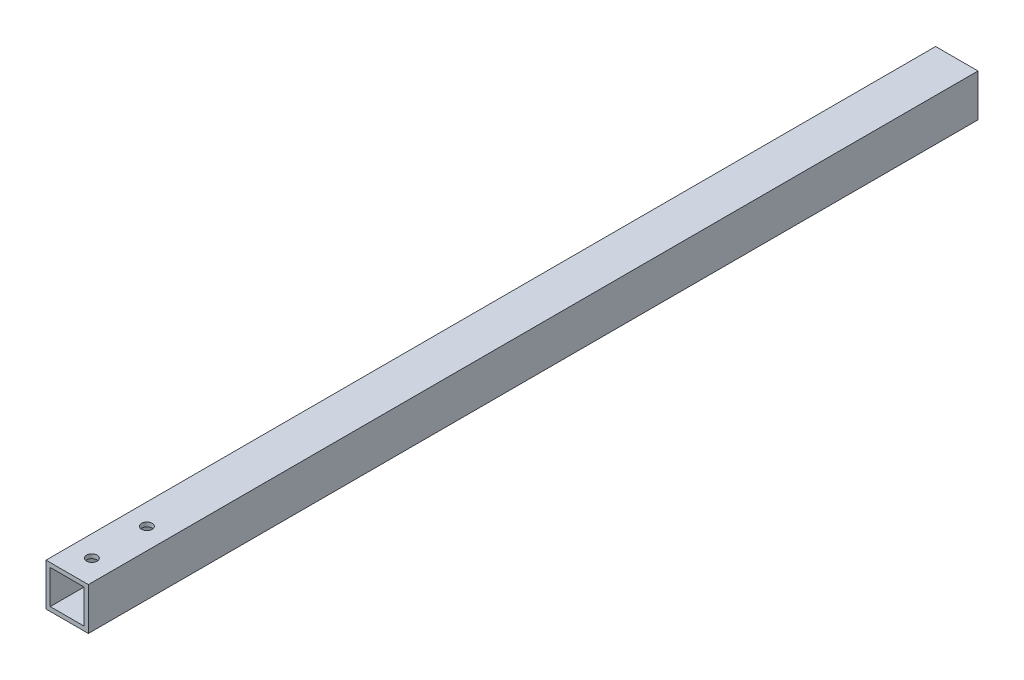
ISO-10303-21;
HEADER;
FILE_DESCRIPTION(('STEP AP214'),'2;1');
FILE_NAME('part.step','',(''),(''),'','','');
FILE_SCHEMA(('AUTOMOTIVE_DESIGN { 1 0 10303 214 1 1 1 1 }'));
ENDSEC;
DATA;
#1=APPLICATION_CONTEXT('core data for automotive mechanical design processes');
#2=APPLICATION_PROTOCOL_DEFINITION('international standard','automotive_design',2000,#1);
#3=PRODUCT_CONTEXT('',#1,'mechanical');
#4=PRODUCT('Part','Part','',(#3));
#5=PRODUCT_RELATED_PRODUCT_CATEGORY('part','',(#4));
#6=PRODUCT_DEFINITION_FORMATION('','',#4);
#7=PRODUCT_DEFINITION_CONTEXT('part definition',#1,'design');
#8=PRODUCT_DEFINITION('design','',#6,#7);
#9=PRODUCT_DEFINITION_SHAPE('','',#8);
#10=(LENGTH_UNIT() NAMED_UNIT(*) SI_UNIT(.MILLI.,.METRE.));
#11=(NAMED_UNIT(*) PLANE_ANGLE_UNIT() SI_UNIT($,.RADIAN.));
#12=(NAMED_UNIT(*) SI_UNIT($,.STERADIAN.) SOLID_ANGLE_UNIT());
#13=UNCERTAINTY_MEASURE_WITH_UNIT(LENGTH_MEASURE(1.E-05),#10,'distance_accuracy_value','');
#14=(GEOMETRIC_REPRESENTATION_CONTEXT(3) GLOBAL_UNCERTAINTY_ASSIGNED_CONTEXT((#13)) GLOBAL_UNIT_ASSIGNED_CONTEXT((#10,
#11,#12)) REPRESENTATION_CONTEXT('',''));
#15=CARTESIAN_POINT('',(0.,0.,0.));
#16=DIRECTION('',(0.,0.,1.));
#17=DIRECTION('',(1.,0.,0.));
#18=AXIS2_PLACEMENT_3D('',#15,#16,#17);
#19=CARTESIAN_POINT('',(0.,0.,210.));
#20=DIRECTION('',(0.,0.,-1.));
#21=DIRECTION('',(-1.,0.,0.));
#22=AXIS2_PLACEMENT_3D('',#19,#20,#21);
#23=PLANE('',#22);
#24=DIRECTION('',(0.,-1.,0.));
#25=VECTOR('',#24,1.);
#26=CARTESIAN_POINT('',(-5.,5.,210.));
#27=LINE('',#26,#25);
#28=CARTESIAN_POINT('',(-5.,5.,210.));
#29=VERTEX_POINT('',#28);
#30=CARTESIAN_POINT('',(-5.,-5.,210.));
#31=VERTEX_POINT('',#30);
#32=EDGE_CURVE('E138',#29,#31,#27,.T.);
#33=ORIENTED_EDGE('',*,*,#32,.T.);
#34=DIRECTION('',(1.,0.,0.));
#35=VECTOR('',#34,1.);
#36=CARTESIAN_POINT('',(5.,-5.,210.));
#37=LINE('',#36,#35);
#38=CARTESIAN_POINT('',(5.,-5.,210.));
#39=VERTEX_POINT('',#38);
#40=EDGE_CURVE('E141',#31,#39,#37,.T.);
#41=ORIENTED_EDGE('',*,*,#40,.T.);
#42=DIRECTION('',(0.,1.,0.));
#43=VECTOR('',#42,1.);
#44=CARTESIAN_POINT('',(5.,5.,210.));
#45=LINE('',#44,#43);
#46=CARTESIAN_POINT('',(5.,5.,210.));
#47=VERTEX_POINT('',#46);
#48=EDGE_CURVE('E144',#39,#47,#45,.T.);
#49=ORIENTED_EDGE('',*,*,#48,.T.);
#50=DIRECTION('',(-1.,0.,0.));
#51=VECTOR('',#50,1.);
#52=CARTESIAN_POINT('',(5.,5.,210.));
#53=LINE('',#52,#51);
#54=EDGE_CURVE('E146',#47,#29,#53,.T.);
#55=ORIENTED_EDGE('',*,*,#54,.T.);
#56=EDGE_LOOP('',(#33,#41,#49,#55));
#57=FACE_BOUND('',#56,.T.);
#58=DIRECTION('',(0.,-1.,0.));
#59=VECTOR('',#58,1.);
#60=CARTESIAN_POINT('',(-4.,4.,210.));
#61=LINE('',#60,#59);
#62=CARTESIAN_POINT('',(-4.,4.,210.));
#63=VERTEX_POINT('',#62);
#64=CARTESIAN_POINT('',(-4.,-4.,210.));
#65=VERTEX_POINT('',#64);
#66=EDGE_CURVE('E100',#63,#65,#61,.T.);
#67=ORIENTED_EDGE('',*,*,#66,.F.);
#68=DIRECTION('',(-1.,0.,0.));
#69=VECTOR('',#68,1.);
#70=CARTESIAN_POINT('',(4.,4.,210.));
#71=LINE('',#70,#69);
#72=CARTESIAN_POINT('',(4.,4.,210.));
#73=VERTEX_POINT('',#72);
#74=EDGE_CURVE('E122',#73,#63,#71,.T.);
#75=ORIENTED_EDGE('',*,*,#74,.F.);
#76=DIRECTION('',(0.,1.,0.));
#77=VECTOR('',#76,1.);
#78=CARTESIAN_POINT('',(4.,4.,210.));
#79=LINE('',#78,#77);
#80=CARTESIAN_POINT('',(4.,-4.,210.));
#81=VERTEX_POINT('',#80);
#82=EDGE_CURVE('E120',#81,#73,#79,.T.);
#83=ORIENTED_EDGE('',*,*,#82,.F.);
#84=DIRECTION('',(1.,0.,0.));
#85=VECTOR('',#84,1.);
#86=CARTESIAN_POINT('',(4.,-4.,210.));
#87=LINE('',#86,#85);
#88=EDGE_CURVE('E108',#65,#81,#87,.T.);
#89=ORIENTED_EDGE('',*,*,#88,.F.);
#90=EDGE_LOOP('',(#67,#75,#83,#89));
#91=FACE_BOUND('',#90,.T.);
#92=ADVANCED_FACE('F34',(#57,#91),#23,.F.);
#93=CARTESIAN_POINT('',(0.,0.,0.));
#94=DIRECTION('',(0.,0.,-1.));
#95=DIRECTION('',(-1.,0.,0.));
#96=AXIS2_PLACEMENT_3D('',#93,#94,#95);
#97=PLANE('',#96);
#98=DIRECTION('',(0.,-1.,0.));
#99=VECTOR('',#98,1.);
#100=CARTESIAN_POINT('',(-5.,5.,0.));
#101=LINE('',#100,#99);
#102=CARTESIAN_POINT('',(-5.,5.,0.));
#103=VERTEX_POINT('',#102);
#104=CARTESIAN_POINT('',(-5.,-5.,0.));
#105=VERTEX_POINT('',#104);
#106=EDGE_CURVE('E116',#103,#105,#101,.T.);
#107=ORIENTED_EDGE('',*,*,#106,.F.);
#108=DIRECTION('',(-1.,0.,0.));
#109=VECTOR('',#108,1.);
#110=CARTESIAN_POINT('',(5.,5.,0.));
#111=LINE('',#110,#109);
#112=CARTESIAN_POINT('',(5.,5.,0.));
#113=VERTEX_POINT('',#112);
#114=EDGE_CURVE('E142',#113,#103,#111,.T.);
#115=ORIENTED_EDGE('',*,*,#114,.F.);
#116=DIRECTION('',(0.,1.,0.));
#117=VECTOR('',#116,1.);
#118=CARTESIAN_POINT('',(5.,5.,0.));
#119=LINE('',#118,#117);
#120=CARTESIAN_POINT('',(5.,-5.,0.));
#121=VERTEX_POINT('',#120);
#122=EDGE_CURVE('E153',#121,#113,#119,.T.);
#123=ORIENTED_EDGE('',*,*,#122,.F.);
#124=DIRECTION('',(1.,0.,0.));
#125=VECTOR('',#124,1.);
#126=CARTESIAN_POINT('',(5.,-5.,0.));
#127=LINE('',#126,#125);
#128=EDGE_CURVE('E151',#105,#121,#127,.T.);
#129=ORIENTED_EDGE('',*,*,#128,.F.);
#130=EDGE_LOOP('',(#107,#115,#123,#129));
#131=FACE_BOUND('',#130,.T.);
#132=DIRECTION('',(-1.,0.,0.));
#133=VECTOR('',#132,1.);
#134=CARTESIAN_POINT('',(4.,4.,0.));
#135=LINE('',#134,#133);
#136=CARTESIAN_POINT('',(4.,4.,0.));
#137=VERTEX_POINT('',#136);
#138=CARTESIAN_POINT('',(-4.,4.,0.));
#139=VERTEX_POINT('',#138);
#140=EDGE_CURVE('E109',#137,#139,#135,.T.);
#141=ORIENTED_EDGE('',*,*,#140,.T.);
#142=DIRECTION('',(0.,-1.,0.));
#143=VECTOR('',#142,1.);
#144=CARTESIAN_POINT('',(-4.,4.,0.));
#145=LINE('',#144,#143);
#146=CARTESIAN_POINT('',(-4.,-4.,0.));
#147=VERTEX_POINT('',#146);
#148=EDGE_CURVE('E58',#139,#147,#145,.T.);
#149=ORIENTED_EDGE('',*,*,#148,.T.);
#150=DIRECTION('',(1.,0.,0.));
#151=VECTOR('',#150,1.);
#152=CARTESIAN_POINT('',(4.,-4.,0.));
#153=LINE('',#152,#151);
#154=CARTESIAN_POINT('',(4.,-4.,0.));
#155=VERTEX_POINT('',#154);
#156=EDGE_CURVE('E115',#147,#155,#153,.T.);
#157=ORIENTED_EDGE('',*,*,#156,.T.);
#158=DIRECTION('',(0.,1.,0.));
#159=VECTOR('',#158,1.);
#160=CARTESIAN_POINT('',(4.,4.,0.));
#161=LINE('',#160,#159);
#162=EDGE_CURVE('E130',#155,#137,#161,.T.);
#163=ORIENTED_EDGE('',*,*,#162,.T.);
#164=EDGE_LOOP('',(#141,#149,#157,#163));
#165=FACE_BOUND('',#164,.T.);
#166=ADVANCED_FACE('F172',(#131,#165),#97,.T.);
#167=CARTESIAN_POINT('',(-5.,5.,210.));
#168=DIRECTION('',(1.,0.,0.));
#169=DIRECTION('',(0.,0.,-1.));
#170=AXIS2_PLACEMENT_3D('',#167,#168,#169);
#171=PLANE('',#170);
#172=ORIENTED_EDGE('',*,*,#106,.T.);
#173=DIRECTION('',(0.,0.,-1.));
#174=VECTOR('',#173,1.);
#175=CARTESIAN_POINT('',(-5.,-5.,210.));
#176=LINE('',#175,#174);
#177=EDGE_CURVE('E11',#31,#105,#176,.T.);
#178=ORIENTED_EDGE('',*,*,#177,.F.);
#179=ORIENTED_EDGE('',*,*,#32,.F.);
#180=DIRECTION('',(0.,0.,-1.));
#181=VECTOR('',#180,1.);
#182=CARTESIAN_POINT('',(-5.,5.,210.));
#183=LINE('',#182,#181);
#184=EDGE_CURVE('E148',#29,#103,#183,.T.);
#185=ORIENTED_EDGE('',*,*,#184,.T.);
#186=EDGE_LOOP('',(#172,#178,#179,#185));
#187=FACE_BOUND('',#186,.T.);
#188=ADVANCED_FACE('F36',(#187),#171,.F.);
#189=CARTESIAN_POINT('',(5.,-5.,210.));
#190=DIRECTION('',(0.,1.,0.));
#191=DIRECTION('',(0.,0.,1.));
#192=AXIS2_PLACEMENT_3D('',#189,#190,#191);
#193=PLANE('',#192);
#194=CARTESIAN_POINT('',(0.,-5.,204.177136038595));
#195=DIRECTION('',(0.,-1.,0.));
#196=DIRECTION('',(0.,0.,-1.));
#197=AXIS2_PLACEMENT_3D('',#194,#195,#196);
#198=CIRCLE('',#197,1.25000000000001);
#199=CARTESIAN_POINT('',(0.,-5.,202.927136038595));
#200=VERTEX_POINT('',#199);
#201=EDGE_CURVE('E260',#200,#200,#198,.T.);
#202=ORIENTED_EDGE('',*,*,#201,.F.);
#203=EDGE_LOOP('',(#202));
#204=FACE_BOUND('',#203,.T.);
#205=CARTESIAN_POINT('',(0.,-5.,191.177136038595));
#206=DIRECTION('',(0.,-1.,0.));
#207=DIRECTION('',(0.,0.,-1.));
#208=AXIS2_PLACEMENT_3D('',#205,#206,#207);
#209=CIRCLE('',#208,1.25000000000001);
#210=CARTESIAN_POINT('',(0.,-5.,189.927136038595));
#211=VERTEX_POINT('',#210);
#212=EDGE_CURVE('E217',#211,#211,#209,.T.);
#213=ORIENTED_EDGE('',*,*,#212,.F.);
#214=EDGE_LOOP('',(#213));
#215=FACE_BOUND('',#214,.T.);
#216=ORIENTED_EDGE('',*,*,#128,.T.);
#217=DIRECTION('',(0.,0.,-1.));
#218=VECTOR('',#217,1.);
#219=CARTESIAN_POINT('',(5.,-5.,210.));
#220=LINE('',#219,#218);
#221=EDGE_CURVE('E43',#39,#121,#220,.T.);
#222=ORIENTED_EDGE('',*,*,#221,.F.);
#223=ORIENTED_EDGE('',*,*,#40,.F.);
#224=ORIENTED_EDGE('',*,*,#177,.T.);
#225=EDGE_LOOP('',(#216,#222,#223,#224));
#226=FACE_BOUND('',#225,.T.);
#227=ADVANCED_FACE('F182',(#204,#215,#226),#193,.F.);
#228=CARTESIAN_POINT('',(5.,5.,210.));
#229=DIRECTION('',(-1.,0.,0.));
#230=DIRECTION('',(0.,0.,1.));
#231=AXIS2_PLACEMENT_3D('',#228,#229,#230);
#232=PLANE('',#231);
#233=ORIENTED_EDGE('',*,*,#122,.T.);
#234=DIRECTION('',(0.,0.,-1.));
#235=VECTOR('',#234,1.);
#236=CARTESIAN_POINT('',(5.,5.,210.));
#237=LINE('',#236,#235);
#238=EDGE_CURVE('E158',#47,#113,#237,.T.);
#239=ORIENTED_EDGE('',*,*,#238,.F.);
#240=ORIENTED_EDGE('',*,*,#48,.F.);
#241=ORIENTED_EDGE('',*,*,#221,.T.);
#242=EDGE_LOOP('',(#233,#239,#240,#241));
#243=FACE_BOUND('',#242,.T.);
#244=ADVANCED_FACE('F166',(#243),#232,.F.);
#245=CARTESIAN_POINT('',(5.,5.,210.));
#246=DIRECTION('',(0.,-1.,0.));
#247=DIRECTION('',(0.,0.,-1.));
#248=AXIS2_PLACEMENT_3D('',#245,#246,#247);
#249=PLANE('',#248);
#250=CARTESIAN_POINT('',(0.,5.,204.177136038595));
#251=DIRECTION('',(0.,-1.,0.));
#252=DIRECTION('',(0.,0.,-1.));
#253=AXIS2_PLACEMENT_3D('',#250,#251,#252);
#254=CIRCLE('',#253,1.25000000000001);
#255=CARTESIAN_POINT('',(0.,5.,202.927136038595));
#256=VERTEX_POINT('',#255);
#257=EDGE_CURVE('E211',#256,#256,#254,.T.);
#258=ORIENTED_EDGE('',*,*,#257,.T.);
#259=EDGE_LOOP('',(#258));
#260=FACE_BOUND('',#259,.T.);
#261=CARTESIAN_POINT('',(0.,5.,191.177136038595));
#262=DIRECTION('',(0.,-1.,0.));
#263=DIRECTION('',(0.,0.,-1.));
#264=AXIS2_PLACEMENT_3D('',#261,#262,#263);
#265=CIRCLE('',#264,1.25000000000001);
#266=CARTESIAN_POINT('',(0.,5.,189.927136038595));
#267=VERTEX_POINT('',#266);
#268=EDGE_CURVE('E214',#267,#267,#265,.T.);
#269=ORIENTED_EDGE('',*,*,#268,.T.);
#270=EDGE_LOOP('',(#269));
#271=FACE_BOUND('',#270,.T.);
#272=ORIENTED_EDGE('',*,*,#114,.T.);
#273=ORIENTED_EDGE('',*,*,#184,.F.);
#274=ORIENTED_EDGE('',*,*,#54,.F.);
#275=ORIENTED_EDGE('',*,*,#238,.T.);
#276=EDGE_LOOP('',(#272,#273,#274,#275));
#277=FACE_BOUND('',#276,.T.);
#278=ADVANCED_FACE('F176',(#260,#271,#277),#249,.F.);
#279=CARTESIAN_POINT('',(-4.,4.,210.));
#280=DIRECTION('',(1.,0.,0.));
#281=DIRECTION('',(0.,0.,-1.));
#282=AXIS2_PLACEMENT_3D('',#279,#280,#281);
#283=PLANE('',#282);
#284=ORIENTED_EDGE('',*,*,#148,.F.);
#285=DIRECTION('',(0.,0.,-1.));
#286=VECTOR('',#285,1.);
#287=CARTESIAN_POINT('',(-4.,4.,210.));
#288=LINE('',#287,#286);
#289=EDGE_CURVE('E104',#63,#139,#288,.T.);
#290=ORIENTED_EDGE('',*,*,#289,.F.);
#291=ORIENTED_EDGE('',*,*,#66,.T.);
#292=DIRECTION('',(0.,0.,-1.));
#293=VECTOR('',#292,1.);
#294=CARTESIAN_POINT('',(-4.,-4.,210.));
#295=LINE('',#294,#293);
#296=EDGE_CURVE('E103',#65,#147,#295,.T.);
#297=ORIENTED_EDGE('',*,*,#296,.T.);
#298=EDGE_LOOP('',(#284,#290,#291,#297));
#299=FACE_BOUND('',#298,.T.);
#300=ADVANCED_FACE('F102',(#299),#283,.T.);
#301=CARTESIAN_POINT('',(4.,-4.,210.));
#302=DIRECTION('',(0.,1.,0.));
#303=DIRECTION('',(0.,0.,1.));
#304=AXIS2_PLACEMENT_3D('',#301,#302,#303);
#305=PLANE('',#304);
#306=CARTESIAN_POINT('',(0.,-4.,204.177136038595));
#307=DIRECTION('',(0.,1.,0.));
#308=DIRECTION('',(0.,0.,1.));
#309=AXIS2_PLACEMENT_3D('',#306,#307,#308);
#310=CIRCLE('',#309,1.25000000000001);
#311=CARTESIAN_POINT('',(0.,-4.,205.427136038595));
#312=VERTEX_POINT('',#311);
#313=EDGE_CURVE('E222',#312,#312,#310,.T.);
#314=ORIENTED_EDGE('',*,*,#313,.F.);
#315=EDGE_LOOP('',(#314));
#316=FACE_BOUND('',#315,.T.);
#317=CARTESIAN_POINT('',(0.,-4.,191.177136038595));
#318=DIRECTION('',(0.,1.,0.));
#319=DIRECTION('',(0.,0.,1.));
#320=AXIS2_PLACEMENT_3D('',#317,#318,#319);
#321=CIRCLE('',#320,1.25000000000001);
#322=CARTESIAN_POINT('',(0.,-4.,192.427136038595));
#323=VERTEX_POINT('',#322);
#324=EDGE_CURVE('E128',#323,#323,#321,.T.);
#325=ORIENTED_EDGE('',*,*,#324,.F.);
#326=EDGE_LOOP('',(#325));
#327=FACE_BOUND('',#326,.T.);
#328=ORIENTED_EDGE('',*,*,#156,.F.);
#329=ORIENTED_EDGE('',*,*,#296,.F.);
#330=ORIENTED_EDGE('',*,*,#88,.T.);
#331=DIRECTION('',(0.,0.,-1.));
#332=VECTOR('',#331,1.);
#333=CARTESIAN_POINT('',(4.,-4.,210.));
#334=LINE('',#333,#332);
#335=EDGE_CURVE('E117',#81,#155,#334,.T.);
#336=ORIENTED_EDGE('',*,*,#335,.T.);
#337=EDGE_LOOP('',(#328,#329,#330,#336));
#338=FACE_BOUND('',#337,.T.);
#339=ADVANCED_FACE('F112',(#316,#327,#338),#305,.T.);
#340=CARTESIAN_POINT('',(4.,4.,210.));
#341=DIRECTION('',(-1.,0.,0.));
#342=DIRECTION('',(0.,0.,1.));
#343=AXIS2_PLACEMENT_3D('',#340,#341,#342);
#344=PLANE('',#343);
#345=ORIENTED_EDGE('',*,*,#162,.F.);
#346=ORIENTED_EDGE('',*,*,#335,.F.);
#347=ORIENTED_EDGE('',*,*,#82,.T.);
#348=DIRECTION('',(0.,0.,-1.));
#349=VECTOR('',#348,1.);
#350=CARTESIAN_POINT('',(4.,4.,210.));
#351=LINE('',#350,#349);
#352=EDGE_CURVE('E50',#73,#137,#351,.T.);
#353=ORIENTED_EDGE('',*,*,#352,.T.);
#354=EDGE_LOOP('',(#345,#346,#347,#353));
#355=FACE_BOUND('',#354,.T.);
#356=ADVANCED_FACE('F231',(#355),#344,.T.);
#357=CARTESIAN_POINT('',(4.,4.,210.));
#358=DIRECTION('',(0.,-1.,0.));
#359=DIRECTION('',(0.,0.,-1.));
#360=AXIS2_PLACEMENT_3D('',#357,#358,#359);
#361=PLANE('',#360);
#362=CARTESIAN_POINT('',(0.,4.,204.177136038595));
#363=DIRECTION('',(0.,-1.,0.));
#364=DIRECTION('',(0.,0.,-1.));
#365=AXIS2_PLACEMENT_3D('',#362,#363,#364);
#366=CIRCLE('',#365,1.25000000000001);
#367=CARTESIAN_POINT('',(0.,4.,202.927136038595));
#368=VERTEX_POINT('',#367);
#369=EDGE_CURVE('E38',#368,#368,#366,.T.);
#370=ORIENTED_EDGE('',*,*,#369,.F.);
#371=EDGE_LOOP('',(#370));
#372=FACE_BOUND('',#371,.T.);
#373=CARTESIAN_POINT('',(0.,4.,191.177136038595));
#374=DIRECTION('',(0.,-1.,0.));
#375=DIRECTION('',(0.,0.,-1.));
#376=AXIS2_PLACEMENT_3D('',#373,#374,#375);
#377=CIRCLE('',#376,1.25000000000001);
#378=CARTESIAN_POINT('',(0.,4.,189.927136038595));
#379=VERTEX_POINT('',#378);
#380=EDGE_CURVE('E216',#379,#379,#377,.T.);
#381=ORIENTED_EDGE('',*,*,#380,.F.);
#382=EDGE_LOOP('',(#381));
#383=FACE_BOUND('',#382,.T.);
#384=ORIENTED_EDGE('',*,*,#140,.F.);
#385=ORIENTED_EDGE('',*,*,#352,.F.);
#386=ORIENTED_EDGE('',*,*,#74,.T.);
#387=ORIENTED_EDGE('',*,*,#289,.T.);
#388=EDGE_LOOP('',(#384,#385,#386,#387));
#389=FACE_BOUND('',#388,.T.);
#390=ADVANCED_FACE('F237',(#372,#383,#389),#361,.T.);
#391=CARTESIAN_POINT('',(0.,-5.,191.177136038595));
#392=DIRECTION('',(0.,-1.,0.));
#393=DIRECTION('',(0.,0.,-1.));
#394=AXIS2_PLACEMENT_3D('',#391,#392,#393);
#395=CYLINDRICAL_SURFACE('',#394,1.25000000000001);
#396=ORIENTED_EDGE('',*,*,#380,.T.);
#397=EDGE_LOOP('',(#396));
#398=FACE_BOUND('',#397,.T.);
#399=ORIENTED_EDGE('',*,*,#268,.F.);
#400=EDGE_LOOP('',(#399));
#401=FACE_BOUND('',#400,.T.);
#402=ADVANCED_FACE('F243',(#398,#401),#395,.F.);
#403=ORIENTED_EDGE('',*,*,#324,.T.);
#404=EDGE_LOOP('',(#403));
#405=FACE_BOUND('',#404,.T.);
#406=ORIENTED_EDGE('',*,*,#212,.T.);
#407=EDGE_LOOP('',(#406));
#408=FACE_BOUND('',#407,.T.);
#409=ADVANCED_FACE('F228',(#405,#408),#395,.F.);
#410=CARTESIAN_POINT('',(0.,-5.,204.177136038595));
#411=DIRECTION('',(0.,-1.,0.));
#412=DIRECTION('',(0.,0.,-1.));
#413=AXIS2_PLACEMENT_3D('',#410,#411,#412);
#414=CYLINDRICAL_SURFACE('',#413,1.25000000000001);
#415=ORIENTED_EDGE('',*,*,#369,.T.);
#416=EDGE_LOOP('',(#415));
#417=FACE_BOUND('',#416,.T.);
#418=ORIENTED_EDGE('',*,*,#257,.F.);
#419=EDGE_LOOP('',(#418));
#420=FACE_BOUND('',#419,.T.);
#421=ADVANCED_FACE('F248',(#417,#420),#414,.F.);
#422=ORIENTED_EDGE('',*,*,#313,.T.);
#423=EDGE_LOOP('',(#422));
#424=FACE_BOUND('',#423,.T.);
#425=ORIENTED_EDGE('',*,*,#201,.T.);
#426=EDGE_LOOP('',(#425));
#427=FACE_BOUND('',#426,.T.);
#428=ADVANCED_FACE('F250',(#424,#427),#414,.F.);
#429=CLOSED_SHELL('',(#92,#166,#188,#227,#244,#278,#300,#339,#356,#390,#402,#409,#421,#428));
#430=MANIFOLD_SOLID_BREP('B2',#429);
#431=ADVANCED_BREP_SHAPE_REPRESENTATION('',(#18,#430),#14);
#432=SHAPE_DEFINITION_REPRESENTATION(#9,#431);
ENDSEC;
END-ISO-10303-21;
